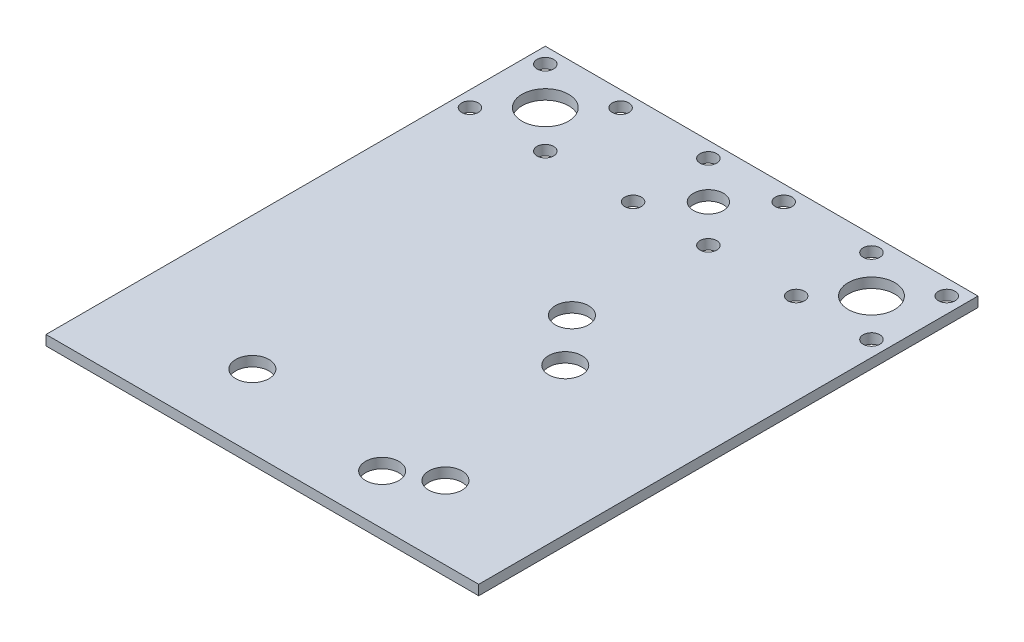
ISO-10303-21;
HEADER;
FILE_DESCRIPTION(('STEP AP214'),'2;1');
FILE_NAME('part.step','',(''),(''),'','','');
FILE_SCHEMA(('AUTOMOTIVE_DESIGN { 1 0 10303 214 1 1 1 1 }'));
ENDSEC;
DATA;
#1=APPLICATION_CONTEXT('core data for automotive mechanical design processes');
#2=APPLICATION_PROTOCOL_DEFINITION('international standard','automotive_design',2000,#1);
#3=PRODUCT_CONTEXT('',#1,'mechanical');
#4=PRODUCT('Part','Part','',(#3));
#5=PRODUCT_RELATED_PRODUCT_CATEGORY('part','',(#4));
#6=PRODUCT_DEFINITION_FORMATION('','',#4);
#7=PRODUCT_DEFINITION_CONTEXT('part definition',#1,'design');
#8=PRODUCT_DEFINITION('design','',#6,#7);
#9=PRODUCT_DEFINITION_SHAPE('','',#8);
#10=(LENGTH_UNIT() NAMED_UNIT(*) SI_UNIT(.MILLI.,.METRE.));
#11=(NAMED_UNIT(*) PLANE_ANGLE_UNIT() SI_UNIT($,.RADIAN.));
#12=(NAMED_UNIT(*) SI_UNIT($,.STERADIAN.) SOLID_ANGLE_UNIT());
#13=UNCERTAINTY_MEASURE_WITH_UNIT(LENGTH_MEASURE(1.E-05),#10,'distance_accuracy_value','');
#14=(GEOMETRIC_REPRESENTATION_CONTEXT(3) GLOBAL_UNCERTAINTY_ASSIGNED_CONTEXT((#13)) GLOBAL_UNIT_ASSIGNED_CONTEXT((#10,
#11,#12)) REPRESENTATION_CONTEXT('',''));
#15=CARTESIAN_POINT('',(0.,0.,0.));
#16=DIRECTION('',(0.,0.,1.));
#17=DIRECTION('',(1.,0.,0.));
#18=AXIS2_PLACEMENT_3D('',#15,#16,#17);
#19=CARTESIAN_POINT('',(0.,3.,0.));
#20=DIRECTION('',(1.,0.,0.));
#21=DIRECTION('',(0.,0.,-1.));
#22=AXIS2_PLACEMENT_3D('',#19,#20,#21);
#23=PLANE('',#22);
#24=DIRECTION('',(0.,0.,1.));
#25=VECTOR('',#24,1.);
#26=CARTESIAN_POINT('',(0.,0.,0.));
#27=LINE('',#26,#25);
#28=CARTESIAN_POINT('',(0.,0.,0.));
#29=VERTEX_POINT('',#28);
#30=CARTESIAN_POINT('',(0.,0.,150.));
#31=VERTEX_POINT('',#30);
#32=EDGE_CURVE('E96',#29,#31,#27,.T.);
#33=ORIENTED_EDGE('',*,*,#32,.T.);
#34=DIRECTION('',(0.,-1.,0.));
#35=VECTOR('',#34,1.);
#36=CARTESIAN_POINT('',(0.,3.,150.));
#37=LINE('',#36,#35);
#38=CARTESIAN_POINT('',(0.,3.,150.));
#39=VERTEX_POINT('',#38);
#40=EDGE_CURVE('E11',#39,#31,#37,.T.);
#41=ORIENTED_EDGE('',*,*,#40,.F.);
#42=DIRECTION('',(0.,0.,1.));
#43=VECTOR('',#42,1.);
#44=CARTESIAN_POINT('',(0.,3.,0.));
#45=LINE('',#44,#43);
#46=CARTESIAN_POINT('',(0.,3.,0.));
#47=VERTEX_POINT('',#46);
#48=EDGE_CURVE('E84',#47,#39,#45,.T.);
#49=ORIENTED_EDGE('',*,*,#48,.F.);
#50=DIRECTION('',(0.,-1.,0.));
#51=VECTOR('',#50,1.);
#52=CARTESIAN_POINT('',(0.,3.,0.));
#53=LINE('',#52,#51);
#54=EDGE_CURVE('E92',#47,#29,#53,.T.);
#55=ORIENTED_EDGE('',*,*,#54,.T.);
#56=EDGE_LOOP('',(#33,#41,#49,#55));
#57=FACE_BOUND('',#56,.T.);
#58=ADVANCED_FACE('F33',(#57),#23,.F.);
#59=CARTESIAN_POINT('',(0.,3.,150.));
#60=DIRECTION('',(0.,0.,-1.));
#61=DIRECTION('',(-1.,0.,0.));
#62=AXIS2_PLACEMENT_3D('',#59,#60,#61);
#63=PLANE('',#62);
#64=DIRECTION('',(1.,0.,0.));
#65=VECTOR('',#64,1.);
#66=CARTESIAN_POINT('',(0.,0.,150.));
#67=LINE('',#66,#65);
#68=CARTESIAN_POINT('',(130.,0.,150.));
#69=VERTEX_POINT('',#68);
#70=EDGE_CURVE('E88',#31,#69,#67,.T.);
#71=ORIENTED_EDGE('',*,*,#70,.T.);
#72=DIRECTION('',(0.,-1.,0.));
#73=VECTOR('',#72,1.);
#74=CARTESIAN_POINT('',(130.,3.,150.));
#75=LINE('',#74,#73);
#76=CARTESIAN_POINT('',(130.,3.,150.));
#77=VERTEX_POINT('',#76);
#78=EDGE_CURVE('E41',#77,#69,#75,.T.);
#79=ORIENTED_EDGE('',*,*,#78,.F.);
#80=DIRECTION('',(1.,0.,0.));
#81=VECTOR('',#80,1.);
#82=CARTESIAN_POINT('',(0.,3.,150.));
#83=LINE('',#82,#81);
#84=EDGE_CURVE('E79',#39,#77,#83,.T.);
#85=ORIENTED_EDGE('',*,*,#84,.F.);
#86=ORIENTED_EDGE('',*,*,#40,.T.);
#87=EDGE_LOOP('',(#71,#79,#85,#86));
#88=FACE_BOUND('',#87,.T.);
#89=ADVANCED_FACE('F87',(#88),#63,.F.);
#90=CARTESIAN_POINT('',(130.,3.,0.));
#91=DIRECTION('',(-1.,0.,0.));
#92=DIRECTION('',(0.,0.,1.));
#93=AXIS2_PLACEMENT_3D('',#90,#91,#92);
#94=PLANE('',#93);
#95=DIRECTION('',(0.,0.,-1.));
#96=VECTOR('',#95,1.);
#97=CARTESIAN_POINT('',(130.,0.,0.));
#98=LINE('',#97,#96);
#99=CARTESIAN_POINT('',(130.,0.,0.));
#100=VERTEX_POINT('',#99);
#101=EDGE_CURVE('E66',#69,#100,#98,.T.);
#102=ORIENTED_EDGE('',*,*,#101,.T.);
#103=DIRECTION('',(0.,-1.,0.));
#104=VECTOR('',#103,1.);
#105=CARTESIAN_POINT('',(130.,3.,0.));
#106=LINE('',#105,#104);
#107=CARTESIAN_POINT('',(130.,3.,0.));
#108=VERTEX_POINT('',#107);
#109=EDGE_CURVE('E89',#108,#100,#106,.T.);
#110=ORIENTED_EDGE('',*,*,#109,.F.);
#111=DIRECTION('',(0.,0.,-1.));
#112=VECTOR('',#111,1.);
#113=CARTESIAN_POINT('',(130.,3.,0.));
#114=LINE('',#113,#112);
#115=EDGE_CURVE('E82',#77,#108,#114,.T.);
#116=ORIENTED_EDGE('',*,*,#115,.F.);
#117=ORIENTED_EDGE('',*,*,#78,.T.);
#118=EDGE_LOOP('',(#102,#110,#116,#117));
#119=FACE_BOUND('',#118,.T.);
#120=ADVANCED_FACE('F90',(#119),#94,.F.);
#121=CARTESIAN_POINT('',(0.,3.,0.));
#122=DIRECTION('',(0.,0.,1.));
#123=DIRECTION('',(1.,0.,0.));
#124=AXIS2_PLACEMENT_3D('',#121,#122,#123);
#125=PLANE('',#124);
#126=DIRECTION('',(-1.,0.,0.));
#127=VECTOR('',#126,1.);
#128=CARTESIAN_POINT('',(0.,0.,0.));
#129=LINE('',#128,#127);
#130=EDGE_CURVE('E72',#100,#29,#129,.T.);
#131=ORIENTED_EDGE('',*,*,#130,.T.);
#132=ORIENTED_EDGE('',*,*,#54,.F.);
#133=DIRECTION('',(-1.,0.,0.));
#134=VECTOR('',#133,1.);
#135=CARTESIAN_POINT('',(0.,3.,0.));
#136=LINE('',#135,#134);
#137=EDGE_CURVE('E49',#108,#47,#136,.T.);
#138=ORIENTED_EDGE('',*,*,#137,.F.);
#139=ORIENTED_EDGE('',*,*,#109,.T.);
#140=EDGE_LOOP('',(#131,#132,#138,#139));
#141=FACE_BOUND('',#140,.T.);
#142=ADVANCED_FACE('F104',(#141),#125,.F.);
#143=CARTESIAN_POINT('',(0.,3.,0.));
#144=DIRECTION('',(0.,1.,0.));
#145=DIRECTION('',(0.,0.,1.));
#146=AXIS2_PLACEMENT_3D('',#143,#144,#145);
#147=PLANE('',#146);
#148=CARTESIAN_POINT('',(53.6862915010153,3.,27.3137084989848));
#149=DIRECTION('',(0.,1.,0.));
#150=DIRECTION('',(0.,0.,1.));
#151=AXIS2_PLACEMENT_3D('',#148,#149,#150);
#152=CIRCLE('',#151,2.5);
#153=CARTESIAN_POINT('',(53.6862915010153,3.,29.8137084989848));
#154=VERTEX_POINT('',#153);
#155=EDGE_CURVE('E226',#154,#154,#152,.T.);
#156=ORIENTED_EDGE('',*,*,#155,.F.);
#157=EDGE_LOOP('',(#156));
#158=FACE_BOUND('',#157,.T.);
#159=CARTESIAN_POINT('',(76.3137084989847,3.,27.3137084989848));
#160=DIRECTION('',(0.,1.,0.));
#161=DIRECTION('',(0.,0.,1.));
#162=AXIS2_PLACEMENT_3D('',#159,#160,#161);
#163=CIRCLE('',#162,2.5);
#164=CARTESIAN_POINT('',(76.3137084989847,3.,29.8137084989848));
#165=VERTEX_POINT('',#164);
#166=EDGE_CURVE('E220',#165,#165,#163,.T.);
#167=ORIENTED_EDGE('',*,*,#166,.F.);
#168=EDGE_LOOP('',(#167));
#169=FACE_BOUND('',#168,.T.);
#170=CARTESIAN_POINT('',(76.3137084989847,3.,4.6862915010152));
#171=DIRECTION('',(0.,1.,0.));
#172=DIRECTION('',(0.,0.,1.));
#173=AXIS2_PLACEMENT_3D('',#170,#171,#172);
#174=CIRCLE('',#173,2.5);
#175=CARTESIAN_POINT('',(76.3137084989847,3.,7.18629150101521));
#176=VERTEX_POINT('',#175);
#177=EDGE_CURVE('E214',#176,#176,#174,.T.);
#178=ORIENTED_EDGE('',*,*,#177,.F.);
#179=EDGE_LOOP('',(#178));
#180=FACE_BOUND('',#179,.T.);
#181=CARTESIAN_POINT('',(53.6862915010153,3.,4.6862915010152));
#182=DIRECTION('',(0.,1.,0.));
#183=DIRECTION('',(0.,0.,1.));
#184=AXIS2_PLACEMENT_3D('',#181,#182,#183);
#185=CIRCLE('',#184,2.5);
#186=CARTESIAN_POINT('',(53.6862915010153,3.,7.18629150101521));
#187=VERTEX_POINT('',#186);
#188=EDGE_CURVE('E208',#187,#187,#185,.T.);
#189=ORIENTED_EDGE('',*,*,#188,.F.);
#190=EDGE_LOOP('',(#189));
#191=FACE_BOUND('',#190,.T.);
#192=CARTESIAN_POINT('',(65.,3.,16.));
#193=DIRECTION('',(0.,1.,0.));
#194=DIRECTION('',(0.,0.,1.));
#195=AXIS2_PLACEMENT_3D('',#192,#193,#194);
#196=CIRCLE('',#195,4.5);
#197=CARTESIAN_POINT('',(65.,3.,20.5));
#198=VERTEX_POINT('',#197);
#199=EDGE_CURVE('E202',#198,#198,#196,.T.);
#200=ORIENTED_EDGE('',*,*,#199,.F.);
#201=EDGE_LOOP('',(#200));
#202=FACE_BOUND('',#201,.T.);
#203=CARTESIAN_POINT('',(86.0000000000001,3.,80.));
#204=DIRECTION('',(0.,1.,0.));
#205=DIRECTION('',(0.,0.,1.));
#206=AXIS2_PLACEMENT_3D('',#203,#204,#205);
#207=CIRCLE('',#206,5.);
#208=CARTESIAN_POINT('',(86.0000000000001,3.,85.));
#209=VERTEX_POINT('',#208);
#210=EDGE_CURVE('E196',#209,#209,#207,.T.);
#211=ORIENTED_EDGE('',*,*,#210,.F.);
#212=EDGE_LOOP('',(#211));
#213=FACE_BOUND('',#212,.T.);
#214=CARTESIAN_POINT('',(86.0000000000001,3.,135.));
#215=DIRECTION('',(0.,1.,0.));
#216=DIRECTION('',(0.,0.,1.));
#217=AXIS2_PLACEMENT_3D('',#214,#215,#216);
#218=CIRCLE('',#217,5.);
#219=CARTESIAN_POINT('',(86.0000000000001,3.,140.));
#220=VERTEX_POINT('',#219);
#221=EDGE_CURVE('E190',#220,#220,#218,.T.);
#222=ORIENTED_EDGE('',*,*,#221,.F.);
#223=EDGE_LOOP('',(#222));
#224=FACE_BOUND('',#223,.T.);
#225=CARTESIAN_POINT('',(4.68629150101523,3.,27.3137084989848));
#226=DIRECTION('',(0.,1.,0.));
#227=DIRECTION('',(0.,0.,1.));
#228=AXIS2_PLACEMENT_3D('',#225,#226,#227);
#229=CIRCLE('',#228,2.5);
#230=CARTESIAN_POINT('',(4.68629150101523,3.,29.8137084989848));
#231=VERTEX_POINT('',#230);
#232=EDGE_CURVE('E184',#231,#231,#229,.T.);
#233=ORIENTED_EDGE('',*,*,#232,.F.);
#234=EDGE_LOOP('',(#233));
#235=FACE_BOUND('',#234,.T.);
#236=CARTESIAN_POINT('',(4.68629150101522,3.,4.68629150101524));
#237=DIRECTION('',(0.,1.,0.));
#238=DIRECTION('',(0.,0.,1.));
#239=AXIS2_PLACEMENT_3D('',#236,#237,#238);
#240=CIRCLE('',#239,2.5);
#241=CARTESIAN_POINT('',(4.68629150101522,3.,7.18629150101524));
#242=VERTEX_POINT('',#241);
#243=EDGE_CURVE('E178',#242,#242,#240,.T.);
#244=ORIENTED_EDGE('',*,*,#243,.F.);
#245=EDGE_LOOP('',(#244));
#246=FACE_BOUND('',#245,.T.);
#247=CARTESIAN_POINT('',(27.3137084989847,3.,4.68629150101524));
#248=DIRECTION('',(0.,1.,0.));
#249=DIRECTION('',(0.,0.,1.));
#250=AXIS2_PLACEMENT_3D('',#247,#248,#249);
#251=CIRCLE('',#250,2.5);
#252=CARTESIAN_POINT('',(27.3137084989847,3.,7.18629150101524));
#253=VERTEX_POINT('',#252);
#254=EDGE_CURVE('E172',#253,#253,#251,.T.);
#255=ORIENTED_EDGE('',*,*,#254,.F.);
#256=EDGE_LOOP('',(#255));
#257=FACE_BOUND('',#256,.T.);
#258=CARTESIAN_POINT('',(27.3137084989847,3.,27.3137084989848));
#259=DIRECTION('',(0.,1.,0.));
#260=DIRECTION('',(0.,0.,1.));
#261=AXIS2_PLACEMENT_3D('',#258,#259,#260);
#262=CIRCLE('',#261,2.5);
#263=CARTESIAN_POINT('',(27.3137084989847,3.,29.8137084989848));
#264=VERTEX_POINT('',#263);
#265=EDGE_CURVE('E166',#264,#264,#262,.T.);
#266=ORIENTED_EDGE('',*,*,#265,.F.);
#267=EDGE_LOOP('',(#266));
#268=FACE_BOUND('',#267,.T.);
#269=CARTESIAN_POINT('',(102.686291501015,3.,27.3137084989848));
#270=DIRECTION('',(0.,1.,0.));
#271=DIRECTION('',(0.,0.,1.));
#272=AXIS2_PLACEMENT_3D('',#269,#270,#271);
#273=CIRCLE('',#272,2.5);
#274=CARTESIAN_POINT('',(102.686291501015,3.,29.8137084989848));
#275=VERTEX_POINT('',#274);
#276=EDGE_CURVE('E160',#275,#275,#273,.T.);
#277=ORIENTED_EDGE('',*,*,#276,.F.);
#278=EDGE_LOOP('',(#277));
#279=FACE_BOUND('',#278,.T.);
#280=CARTESIAN_POINT('',(125.313708498985,3.,27.3137084989848));
#281=DIRECTION('',(0.,1.,0.));
#282=DIRECTION('',(0.,0.,1.));
#283=AXIS2_PLACEMENT_3D('',#280,#281,#282);
#284=CIRCLE('',#283,2.5);
#285=CARTESIAN_POINT('',(125.313708498985,3.,29.8137084989848));
#286=VERTEX_POINT('',#285);
#287=EDGE_CURVE('E154',#286,#286,#284,.T.);
#288=ORIENTED_EDGE('',*,*,#287,.F.);
#289=EDGE_LOOP('',(#288));
#290=FACE_BOUND('',#289,.T.);
#291=CARTESIAN_POINT('',(125.313708498985,3.,4.68629150101525));
#292=DIRECTION('',(0.,1.,0.));
#293=DIRECTION('',(0.,0.,1.));
#294=AXIS2_PLACEMENT_3D('',#291,#292,#293);
#295=CIRCLE('',#294,2.5);
#296=CARTESIAN_POINT('',(125.313708498985,3.,7.18629150101525));
#297=VERTEX_POINT('',#296);
#298=EDGE_CURVE('E148',#297,#297,#295,.T.);
#299=ORIENTED_EDGE('',*,*,#298,.F.);
#300=EDGE_LOOP('',(#299));
#301=FACE_BOUND('',#300,.T.);
#302=CARTESIAN_POINT('',(102.686291501015,3.,4.68629150101525));
#303=DIRECTION('',(0.,1.,0.));
#304=DIRECTION('',(0.,0.,1.));
#305=AXIS2_PLACEMENT_3D('',#302,#303,#304);
#306=CIRCLE('',#305,2.5);
#307=CARTESIAN_POINT('',(102.686291501015,3.,7.18629150101525));
#308=VERTEX_POINT('',#307);
#309=EDGE_CURVE('E142',#308,#308,#306,.T.);
#310=ORIENTED_EDGE('',*,*,#309,.F.);
#311=EDGE_LOOP('',(#310));
#312=FACE_BOUND('',#311,.T.);
#313=CARTESIAN_POINT('',(16.,3.,16.));
#314=DIRECTION('',(0.,1.,0.));
#315=DIRECTION('',(0.,0.,1.));
#316=AXIS2_PLACEMENT_3D('',#313,#314,#315);
#317=CIRCLE('',#316,7.);
#318=CARTESIAN_POINT('',(16.,3.,23.));
#319=VERTEX_POINT('',#318);
#320=EDGE_CURVE('E136',#319,#319,#317,.T.);
#321=ORIENTED_EDGE('',*,*,#320,.F.);
#322=EDGE_LOOP('',(#321));
#323=FACE_BOUND('',#322,.T.);
#324=CARTESIAN_POINT('',(114.,3.,16.));
#325=DIRECTION('',(0.,1.,0.));
#326=DIRECTION('',(0.,0.,1.));
#327=AXIS2_PLACEMENT_3D('',#324,#325,#326);
#328=CIRCLE('',#327,7.00000000000001);
#329=CARTESIAN_POINT('',(114.,3.,23.));
#330=VERTEX_POINT('',#329);
#331=EDGE_CURVE('E130',#330,#330,#328,.T.);
#332=ORIENTED_EDGE('',*,*,#331,.F.);
#333=EDGE_LOOP('',(#332));
#334=FACE_BOUND('',#333,.T.);
#335=CARTESIAN_POINT('',(98.0000000000001,3.,128.));
#336=DIRECTION('',(0.,1.,0.));
#337=DIRECTION('',(0.,0.,1.));
#338=AXIS2_PLACEMENT_3D('',#335,#336,#337);
#339=CIRCLE('',#338,5.);
#340=CARTESIAN_POINT('',(98.0000000000001,3.,133.));
#341=VERTEX_POINT('',#340);
#342=EDGE_CURVE('E124',#341,#341,#339,.T.);
#343=ORIENTED_EDGE('',*,*,#342,.F.);
#344=EDGE_LOOP('',(#343));
#345=FACE_BOUND('',#344,.T.);
#346=CARTESIAN_POINT('',(40.0000000000001,3.,128.));
#347=DIRECTION('',(0.,1.,0.));
#348=DIRECTION('',(0.,0.,1.));
#349=AXIS2_PLACEMENT_3D('',#346,#347,#348);
#350=CIRCLE('',#349,5.);
#351=CARTESIAN_POINT('',(40.0000000000001,3.,133.));
#352=VERTEX_POINT('',#351);
#353=EDGE_CURVE('E118',#352,#352,#350,.T.);
#354=ORIENTED_EDGE('',*,*,#353,.F.);
#355=EDGE_LOOP('',(#354));
#356=FACE_BOUND('',#355,.T.);
#357=CARTESIAN_POINT('',(74.0000000000001,3.,66.));
#358=DIRECTION('',(0.,1.,0.));
#359=DIRECTION('',(0.,0.,1.));
#360=AXIS2_PLACEMENT_3D('',#357,#358,#359);
#361=CIRCLE('',#360,5.);
#362=CARTESIAN_POINT('',(74.0000000000001,3.,71.));
#363=VERTEX_POINT('',#362);
#364=EDGE_CURVE('E112',#363,#363,#361,.T.);
#365=ORIENTED_EDGE('',*,*,#364,.F.);
#366=EDGE_LOOP('',(#365));
#367=FACE_BOUND('',#366,.T.);
#368=ORIENTED_EDGE('',*,*,#48,.T.);
#369=ORIENTED_EDGE('',*,*,#84,.T.);
#370=ORIENTED_EDGE('',*,*,#115,.T.);
#371=ORIENTED_EDGE('',*,*,#137,.T.);
#372=EDGE_LOOP('',(#368,#369,#370,#371));
#373=FACE_BOUND('',#372,.T.);
#374=ADVANCED_FACE('F80',(#158,#169,#180,#191,#202,#213,#224,#235,#246,#257,#268,#279,#290,#301,
#312,#323,#334,#345,#356,#367,#373),#147,.T.);
#375=CARTESIAN_POINT('',(0.,0.,0.));
#376=DIRECTION('',(0.,1.,0.));
#377=DIRECTION('',(0.,0.,1.));
#378=AXIS2_PLACEMENT_3D('',#375,#376,#377);
#379=PLANE('',#378);
#380=CARTESIAN_POINT('',(53.6862915010153,0.,27.3137084989848));
#381=DIRECTION('',(0.,1.,0.));
#382=DIRECTION('',(0.,0.,1.));
#383=AXIS2_PLACEMENT_3D('',#380,#381,#382);
#384=CIRCLE('',#383,2.5);
#385=CARTESIAN_POINT('',(53.6862915010153,0.,29.8137084989848));
#386=VERTEX_POINT('',#385);
#387=EDGE_CURVE('E223',#386,#386,#384,.T.);
#388=ORIENTED_EDGE('',*,*,#387,.T.);
#389=EDGE_LOOP('',(#388));
#390=FACE_BOUND('',#389,.T.);
#391=CARTESIAN_POINT('',(76.3137084989847,0.,27.3137084989848));
#392=DIRECTION('',(0.,1.,0.));
#393=DIRECTION('',(0.,0.,1.));
#394=AXIS2_PLACEMENT_3D('',#391,#392,#393);
#395=CIRCLE('',#394,2.5);
#396=CARTESIAN_POINT('',(76.3137084989847,0.,29.8137084989848));
#397=VERTEX_POINT('',#396);
#398=EDGE_CURVE('E217',#397,#397,#395,.T.);
#399=ORIENTED_EDGE('',*,*,#398,.T.);
#400=EDGE_LOOP('',(#399));
#401=FACE_BOUND('',#400,.T.);
#402=CARTESIAN_POINT('',(76.3137084989847,0.,4.6862915010152));
#403=DIRECTION('',(0.,1.,0.));
#404=DIRECTION('',(0.,0.,1.));
#405=AXIS2_PLACEMENT_3D('',#402,#403,#404);
#406=CIRCLE('',#405,2.5);
#407=CARTESIAN_POINT('',(76.3137084989847,0.,7.18629150101521));
#408=VERTEX_POINT('',#407);
#409=EDGE_CURVE('E211',#408,#408,#406,.T.);
#410=ORIENTED_EDGE('',*,*,#409,.T.);
#411=EDGE_LOOP('',(#410));
#412=FACE_BOUND('',#411,.T.);
#413=CARTESIAN_POINT('',(53.6862915010153,0.,4.6862915010152));
#414=DIRECTION('',(0.,1.,0.));
#415=DIRECTION('',(0.,0.,1.));
#416=AXIS2_PLACEMENT_3D('',#413,#414,#415);
#417=CIRCLE('',#416,2.5);
#418=CARTESIAN_POINT('',(53.6862915010153,0.,7.18629150101521));
#419=VERTEX_POINT('',#418);
#420=EDGE_CURVE('E205',#419,#419,#417,.T.);
#421=ORIENTED_EDGE('',*,*,#420,.T.);
#422=EDGE_LOOP('',(#421));
#423=FACE_BOUND('',#422,.T.);
#424=CARTESIAN_POINT('',(65.,0.,16.));
#425=DIRECTION('',(0.,1.,0.));
#426=DIRECTION('',(0.,0.,1.));
#427=AXIS2_PLACEMENT_3D('',#424,#425,#426);
#428=CIRCLE('',#427,4.5);
#429=CARTESIAN_POINT('',(65.,0.,20.5));
#430=VERTEX_POINT('',#429);
#431=EDGE_CURVE('E199',#430,#430,#428,.T.);
#432=ORIENTED_EDGE('',*,*,#431,.T.);
#433=EDGE_LOOP('',(#432));
#434=FACE_BOUND('',#433,.T.);
#435=CARTESIAN_POINT('',(86.0000000000001,0.,80.));
#436=DIRECTION('',(0.,1.,0.));
#437=DIRECTION('',(0.,0.,1.));
#438=AXIS2_PLACEMENT_3D('',#435,#436,#437);
#439=CIRCLE('',#438,5.);
#440=CARTESIAN_POINT('',(86.0000000000001,0.,85.));
#441=VERTEX_POINT('',#440);
#442=EDGE_CURVE('E193',#441,#441,#439,.T.);
#443=ORIENTED_EDGE('',*,*,#442,.T.);
#444=EDGE_LOOP('',(#443));
#445=FACE_BOUND('',#444,.T.);
#446=CARTESIAN_POINT('',(86.0000000000001,0.,135.));
#447=DIRECTION('',(0.,1.,0.));
#448=DIRECTION('',(0.,0.,1.));
#449=AXIS2_PLACEMENT_3D('',#446,#447,#448);
#450=CIRCLE('',#449,5.);
#451=CARTESIAN_POINT('',(86.0000000000001,0.,140.));
#452=VERTEX_POINT('',#451);
#453=EDGE_CURVE('E187',#452,#452,#450,.T.);
#454=ORIENTED_EDGE('',*,*,#453,.T.);
#455=EDGE_LOOP('',(#454));
#456=FACE_BOUND('',#455,.T.);
#457=CARTESIAN_POINT('',(4.68629150101523,0.,27.3137084989848));
#458=DIRECTION('',(0.,1.,0.));
#459=DIRECTION('',(0.,0.,1.));
#460=AXIS2_PLACEMENT_3D('',#457,#458,#459);
#461=CIRCLE('',#460,2.5);
#462=CARTESIAN_POINT('',(4.68629150101523,0.,29.8137084989848));
#463=VERTEX_POINT('',#462);
#464=EDGE_CURVE('E181',#463,#463,#461,.T.);
#465=ORIENTED_EDGE('',*,*,#464,.T.);
#466=EDGE_LOOP('',(#465));
#467=FACE_BOUND('',#466,.T.);
#468=CARTESIAN_POINT('',(4.68629150101522,0.,4.68629150101524));
#469=DIRECTION('',(0.,1.,0.));
#470=DIRECTION('',(0.,0.,1.));
#471=AXIS2_PLACEMENT_3D('',#468,#469,#470);
#472=CIRCLE('',#471,2.5);
#473=CARTESIAN_POINT('',(4.68629150101522,0.,7.18629150101524));
#474=VERTEX_POINT('',#473);
#475=EDGE_CURVE('E175',#474,#474,#472,.T.);
#476=ORIENTED_EDGE('',*,*,#475,.T.);
#477=EDGE_LOOP('',(#476));
#478=FACE_BOUND('',#477,.T.);
#479=CARTESIAN_POINT('',(27.3137084989847,0.,4.68629150101524));
#480=DIRECTION('',(0.,1.,0.));
#481=DIRECTION('',(0.,0.,1.));
#482=AXIS2_PLACEMENT_3D('',#479,#480,#481);
#483=CIRCLE('',#482,2.5);
#484=CARTESIAN_POINT('',(27.3137084989847,0.,7.18629150101524));
#485=VERTEX_POINT('',#484);
#486=EDGE_CURVE('E169',#485,#485,#483,.T.);
#487=ORIENTED_EDGE('',*,*,#486,.T.);
#488=EDGE_LOOP('',(#487));
#489=FACE_BOUND('',#488,.T.);
#490=CARTESIAN_POINT('',(27.3137084989847,0.,27.3137084989848));
#491=DIRECTION('',(0.,1.,0.));
#492=DIRECTION('',(0.,0.,1.));
#493=AXIS2_PLACEMENT_3D('',#490,#491,#492);
#494=CIRCLE('',#493,2.5);
#495=CARTESIAN_POINT('',(27.3137084989847,0.,29.8137084989848));
#496=VERTEX_POINT('',#495);
#497=EDGE_CURVE('E163',#496,#496,#494,.T.);
#498=ORIENTED_EDGE('',*,*,#497,.T.);
#499=EDGE_LOOP('',(#498));
#500=FACE_BOUND('',#499,.T.);
#501=CARTESIAN_POINT('',(102.686291501015,0.,27.3137084989848));
#502=DIRECTION('',(0.,1.,0.));
#503=DIRECTION('',(0.,0.,1.));
#504=AXIS2_PLACEMENT_3D('',#501,#502,#503);
#505=CIRCLE('',#504,2.5);
#506=CARTESIAN_POINT('',(102.686291501015,0.,29.8137084989848));
#507=VERTEX_POINT('',#506);
#508=EDGE_CURVE('E157',#507,#507,#505,.T.);
#509=ORIENTED_EDGE('',*,*,#508,.T.);
#510=EDGE_LOOP('',(#509));
#511=FACE_BOUND('',#510,.T.);
#512=CARTESIAN_POINT('',(125.313708498985,0.,27.3137084989848));
#513=DIRECTION('',(0.,1.,0.));
#514=DIRECTION('',(0.,0.,1.));
#515=AXIS2_PLACEMENT_3D('',#512,#513,#514);
#516=CIRCLE('',#515,2.5);
#517=CARTESIAN_POINT('',(125.313708498985,0.,29.8137084989848));
#518=VERTEX_POINT('',#517);
#519=EDGE_CURVE('E151',#518,#518,#516,.T.);
#520=ORIENTED_EDGE('',*,*,#519,.T.);
#521=EDGE_LOOP('',(#520));
#522=FACE_BOUND('',#521,.T.);
#523=CARTESIAN_POINT('',(125.313708498985,0.,4.68629150101525));
#524=DIRECTION('',(0.,1.,0.));
#525=DIRECTION('',(0.,0.,1.));
#526=AXIS2_PLACEMENT_3D('',#523,#524,#525);
#527=CIRCLE('',#526,2.5);
#528=CARTESIAN_POINT('',(125.313708498985,0.,7.18629150101525));
#529=VERTEX_POINT('',#528);
#530=EDGE_CURVE('E145',#529,#529,#527,.T.);
#531=ORIENTED_EDGE('',*,*,#530,.T.);
#532=EDGE_LOOP('',(#531));
#533=FACE_BOUND('',#532,.T.);
#534=CARTESIAN_POINT('',(102.686291501015,0.,4.68629150101525));
#535=DIRECTION('',(0.,1.,0.));
#536=DIRECTION('',(0.,0.,1.));
#537=AXIS2_PLACEMENT_3D('',#534,#535,#536);
#538=CIRCLE('',#537,2.5);
#539=CARTESIAN_POINT('',(102.686291501015,0.,7.18629150101525));
#540=VERTEX_POINT('',#539);
#541=EDGE_CURVE('E139',#540,#540,#538,.T.);
#542=ORIENTED_EDGE('',*,*,#541,.T.);
#543=EDGE_LOOP('',(#542));
#544=FACE_BOUND('',#543,.T.);
#545=CARTESIAN_POINT('',(16.,0.,16.));
#546=DIRECTION('',(0.,1.,0.));
#547=DIRECTION('',(0.,0.,1.));
#548=AXIS2_PLACEMENT_3D('',#545,#546,#547);
#549=CIRCLE('',#548,7.);
#550=CARTESIAN_POINT('',(16.,0.,23.));
#551=VERTEX_POINT('',#550);
#552=EDGE_CURVE('E133',#551,#551,#549,.T.);
#553=ORIENTED_EDGE('',*,*,#552,.T.);
#554=EDGE_LOOP('',(#553));
#555=FACE_BOUND('',#554,.T.);
#556=CARTESIAN_POINT('',(114.,0.,16.));
#557=DIRECTION('',(0.,1.,0.));
#558=DIRECTION('',(0.,0.,1.));
#559=AXIS2_PLACEMENT_3D('',#556,#557,#558);
#560=CIRCLE('',#559,7.00000000000001);
#561=CARTESIAN_POINT('',(114.,0.,23.));
#562=VERTEX_POINT('',#561);
#563=EDGE_CURVE('E127',#562,#562,#560,.T.);
#564=ORIENTED_EDGE('',*,*,#563,.T.);
#565=EDGE_LOOP('',(#564));
#566=FACE_BOUND('',#565,.T.);
#567=CARTESIAN_POINT('',(98.0000000000001,0.,128.));
#568=DIRECTION('',(0.,1.,0.));
#569=DIRECTION('',(0.,0.,1.));
#570=AXIS2_PLACEMENT_3D('',#567,#568,#569);
#571=CIRCLE('',#570,5.);
#572=CARTESIAN_POINT('',(98.0000000000001,0.,133.));
#573=VERTEX_POINT('',#572);
#574=EDGE_CURVE('E121',#573,#573,#571,.T.);
#575=ORIENTED_EDGE('',*,*,#574,.T.);
#576=EDGE_LOOP('',(#575));
#577=FACE_BOUND('',#576,.T.);
#578=CARTESIAN_POINT('',(40.0000000000001,0.,128.));
#579=DIRECTION('',(0.,1.,0.));
#580=DIRECTION('',(0.,0.,1.));
#581=AXIS2_PLACEMENT_3D('',#578,#579,#580);
#582=CIRCLE('',#581,5.);
#583=CARTESIAN_POINT('',(40.0000000000001,0.,133.));
#584=VERTEX_POINT('',#583);
#585=EDGE_CURVE('E115',#584,#584,#582,.T.);
#586=ORIENTED_EDGE('',*,*,#585,.T.);
#587=EDGE_LOOP('',(#586));
#588=FACE_BOUND('',#587,.T.);
#589=CARTESIAN_POINT('',(74.0000000000001,0.,66.));
#590=DIRECTION('',(0.,1.,0.));
#591=DIRECTION('',(0.,0.,1.));
#592=AXIS2_PLACEMENT_3D('',#589,#590,#591);
#593=CIRCLE('',#592,5.);
#594=CARTESIAN_POINT('',(74.0000000000001,0.,71.));
#595=VERTEX_POINT('',#594);
#596=EDGE_CURVE('E99',#595,#595,#593,.T.);
#597=ORIENTED_EDGE('',*,*,#596,.T.);
#598=EDGE_LOOP('',(#597));
#599=FACE_BOUND('',#598,.T.);
#600=ORIENTED_EDGE('',*,*,#32,.F.);
#601=ORIENTED_EDGE('',*,*,#130,.F.);
#602=ORIENTED_EDGE('',*,*,#101,.F.);
#603=ORIENTED_EDGE('',*,*,#70,.F.);
#604=EDGE_LOOP('',(#600,#601,#602,#603));
#605=FACE_BOUND('',#604,.T.);
#606=ADVANCED_FACE('F107',(#390,#401,#412,#423,#434,#445,#456,#467,#478,#489,#500,#511,#522,
#533,#544,#555,#566,#577,#588,#599,#605),#379,.F.);
#607=CARTESIAN_POINT('',(74.0000000000001,3.,66.));
#608=DIRECTION('',(0.,1.,0.));
#609=DIRECTION('',(0.,0.,1.));
#610=AXIS2_PLACEMENT_3D('',#607,#608,#609);
#611=CYLINDRICAL_SURFACE('',#610,5.);
#612=ORIENTED_EDGE('',*,*,#596,.F.);
#613=EDGE_LOOP('',(#612));
#614=FACE_BOUND('',#613,.T.);
#615=ORIENTED_EDGE('',*,*,#364,.T.);
#616=EDGE_LOOP('',(#615));
#617=FACE_BOUND('',#616,.T.);
#618=ADVANCED_FACE('F273',(#614,#617),#611,.F.);
#619=CARTESIAN_POINT('',(40.0000000000001,3.,128.));
#620=DIRECTION('',(0.,1.,0.));
#621=DIRECTION('',(0.,0.,1.));
#622=AXIS2_PLACEMENT_3D('',#619,#620,#621);
#623=CYLINDRICAL_SURFACE('',#622,5.);
#624=ORIENTED_EDGE('',*,*,#585,.F.);
#625=EDGE_LOOP('',(#624));
#626=FACE_BOUND('',#625,.T.);
#627=ORIENTED_EDGE('',*,*,#353,.T.);
#628=EDGE_LOOP('',(#627));
#629=FACE_BOUND('',#628,.T.);
#630=ADVANCED_FACE('F275',(#626,#629),#623,.F.);
#631=CARTESIAN_POINT('',(98.0000000000001,3.,128.));
#632=DIRECTION('',(0.,1.,0.));
#633=DIRECTION('',(0.,0.,1.));
#634=AXIS2_PLACEMENT_3D('',#631,#632,#633);
#635=CYLINDRICAL_SURFACE('',#634,5.);
#636=ORIENTED_EDGE('',*,*,#574,.F.);
#637=EDGE_LOOP('',(#636));
#638=FACE_BOUND('',#637,.T.);
#639=ORIENTED_EDGE('',*,*,#342,.T.);
#640=EDGE_LOOP('',(#639));
#641=FACE_BOUND('',#640,.T.);
#642=ADVANCED_FACE('F282',(#638,#641),#635,.F.);
#643=CARTESIAN_POINT('',(114.,3.,16.));
#644=DIRECTION('',(0.,1.,0.));
#645=DIRECTION('',(0.,0.,1.));
#646=AXIS2_PLACEMENT_3D('',#643,#644,#645);
#647=CYLINDRICAL_SURFACE('',#646,7.00000000000001);
#648=ORIENTED_EDGE('',*,*,#563,.F.);
#649=EDGE_LOOP('',(#648));
#650=FACE_BOUND('',#649,.T.);
#651=ORIENTED_EDGE('',*,*,#331,.T.);
#652=EDGE_LOOP('',(#651));
#653=FACE_BOUND('',#652,.T.);
#654=ADVANCED_FACE('F405',(#650,#653),#647,.F.);
#655=CARTESIAN_POINT('',(16.,3.,16.));
#656=DIRECTION('',(0.,1.,0.));
#657=DIRECTION('',(0.,0.,1.));
#658=AXIS2_PLACEMENT_3D('',#655,#656,#657);
#659=CYLINDRICAL_SURFACE('',#658,7.);
#660=ORIENTED_EDGE('',*,*,#552,.F.);
#661=EDGE_LOOP('',(#660));
#662=FACE_BOUND('',#661,.T.);
#663=ORIENTED_EDGE('',*,*,#320,.T.);
#664=EDGE_LOOP('',(#663));
#665=FACE_BOUND('',#664,.T.);
#666=ADVANCED_FACE('F401',(#662,#665),#659,.F.);
#667=CARTESIAN_POINT('',(102.686291501015,3.,4.68629150101525));
#668=DIRECTION('',(0.,1.,0.));
#669=DIRECTION('',(0.,0.,1.));
#670=AXIS2_PLACEMENT_3D('',#667,#668,#669);
#671=CYLINDRICAL_SURFACE('',#670,2.5);
#672=ORIENTED_EDGE('',*,*,#541,.F.);
#673=EDGE_LOOP('',(#672));
#674=FACE_BOUND('',#673,.T.);
#675=ORIENTED_EDGE('',*,*,#309,.T.);
#676=EDGE_LOOP('',(#675));
#677=FACE_BOUND('',#676,.T.);
#678=ADVANCED_FACE('F397',(#674,#677),#671,.F.);
#679=CARTESIAN_POINT('',(125.313708498985,3.,4.68629150101525));
#680=DIRECTION('',(0.,1.,0.));
#681=DIRECTION('',(0.,0.,1.));
#682=AXIS2_PLACEMENT_3D('',#679,#680,#681);
#683=CYLINDRICAL_SURFACE('',#682,2.5);
#684=ORIENTED_EDGE('',*,*,#530,.F.);
#685=EDGE_LOOP('',(#684));
#686=FACE_BOUND('',#685,.T.);
#687=ORIENTED_EDGE('',*,*,#298,.T.);
#688=EDGE_LOOP('',(#687));
#689=FACE_BOUND('',#688,.T.);
#690=ADVANCED_FACE('F393',(#686,#689),#683,.F.);
#691=CARTESIAN_POINT('',(125.313708498985,3.,27.3137084989848));
#692=DIRECTION('',(0.,1.,0.));
#693=DIRECTION('',(0.,0.,1.));
#694=AXIS2_PLACEMENT_3D('',#691,#692,#693);
#695=CYLINDRICAL_SURFACE('',#694,2.5);
#696=ORIENTED_EDGE('',*,*,#519,.F.);
#697=EDGE_LOOP('',(#696));
#698=FACE_BOUND('',#697,.T.);
#699=ORIENTED_EDGE('',*,*,#287,.T.);
#700=EDGE_LOOP('',(#699));
#701=FACE_BOUND('',#700,.T.);
#702=ADVANCED_FACE('F389',(#698,#701),#695,.F.);
#703=CARTESIAN_POINT('',(102.686291501015,3.,27.3137084989848));
#704=DIRECTION('',(0.,1.,0.));
#705=DIRECTION('',(0.,0.,1.));
#706=AXIS2_PLACEMENT_3D('',#703,#704,#705);
#707=CYLINDRICAL_SURFACE('',#706,2.5);
#708=ORIENTED_EDGE('',*,*,#508,.F.);
#709=EDGE_LOOP('',(#708));
#710=FACE_BOUND('',#709,.T.);
#711=ORIENTED_EDGE('',*,*,#276,.T.);
#712=EDGE_LOOP('',(#711));
#713=FACE_BOUND('',#712,.T.);
#714=ADVANCED_FACE('F385',(#710,#713),#707,.F.);
#715=CARTESIAN_POINT('',(27.3137084989847,3.,27.3137084989848));
#716=DIRECTION('',(0.,1.,0.));
#717=DIRECTION('',(0.,0.,1.));
#718=AXIS2_PLACEMENT_3D('',#715,#716,#717);
#719=CYLINDRICAL_SURFACE('',#718,2.5);
#720=ORIENTED_EDGE('',*,*,#497,.F.);
#721=EDGE_LOOP('',(#720));
#722=FACE_BOUND('',#721,.T.);
#723=ORIENTED_EDGE('',*,*,#265,.T.);
#724=EDGE_LOOP('',(#723));
#725=FACE_BOUND('',#724,.T.);
#726=ADVANCED_FACE('F381',(#722,#725),#719,.F.);
#727=CARTESIAN_POINT('',(27.3137084989847,3.,4.68629150101524));
#728=DIRECTION('',(0.,1.,0.));
#729=DIRECTION('',(0.,0.,1.));
#730=AXIS2_PLACEMENT_3D('',#727,#728,#729);
#731=CYLINDRICAL_SURFACE('',#730,2.5);
#732=ORIENTED_EDGE('',*,*,#486,.F.);
#733=EDGE_LOOP('',(#732));
#734=FACE_BOUND('',#733,.T.);
#735=ORIENTED_EDGE('',*,*,#254,.T.);
#736=EDGE_LOOP('',(#735));
#737=FACE_BOUND('',#736,.T.);
#738=ADVANCED_FACE('F377',(#734,#737),#731,.F.);
#739=CARTESIAN_POINT('',(4.68629150101522,3.,4.68629150101524));
#740=DIRECTION('',(0.,1.,0.));
#741=DIRECTION('',(0.,0.,1.));
#742=AXIS2_PLACEMENT_3D('',#739,#740,#741);
#743=CYLINDRICAL_SURFACE('',#742,2.5);
#744=ORIENTED_EDGE('',*,*,#475,.F.);
#745=EDGE_LOOP('',(#744));
#746=FACE_BOUND('',#745,.T.);
#747=ORIENTED_EDGE('',*,*,#243,.T.);
#748=EDGE_LOOP('',(#747));
#749=FACE_BOUND('',#748,.T.);
#750=ADVANCED_FACE('F373',(#746,#749),#743,.F.);
#751=CARTESIAN_POINT('',(4.68629150101523,3.,27.3137084989848));
#752=DIRECTION('',(0.,1.,0.));
#753=DIRECTION('',(0.,0.,1.));
#754=AXIS2_PLACEMENT_3D('',#751,#752,#753);
#755=CYLINDRICAL_SURFACE('',#754,2.5);
#756=ORIENTED_EDGE('',*,*,#464,.F.);
#757=EDGE_LOOP('',(#756));
#758=FACE_BOUND('',#757,.T.);
#759=ORIENTED_EDGE('',*,*,#232,.T.);
#760=EDGE_LOOP('',(#759));
#761=FACE_BOUND('',#760,.T.);
#762=ADVANCED_FACE('F369',(#758,#761),#755,.F.);
#763=CARTESIAN_POINT('',(86.0000000000001,3.,135.));
#764=DIRECTION('',(0.,1.,0.));
#765=DIRECTION('',(0.,0.,1.));
#766=AXIS2_PLACEMENT_3D('',#763,#764,#765);
#767=CYLINDRICAL_SURFACE('',#766,5.);
#768=ORIENTED_EDGE('',*,*,#453,.F.);
#769=EDGE_LOOP('',(#768));
#770=FACE_BOUND('',#769,.T.);
#771=ORIENTED_EDGE('',*,*,#221,.T.);
#772=EDGE_LOOP('',(#771));
#773=FACE_BOUND('',#772,.T.);
#774=ADVANCED_FACE('F365',(#770,#773),#767,.F.);
#775=CARTESIAN_POINT('',(86.0000000000001,3.,80.));
#776=DIRECTION('',(0.,1.,0.));
#777=DIRECTION('',(0.,0.,1.));
#778=AXIS2_PLACEMENT_3D('',#775,#776,#777);
#779=CYLINDRICAL_SURFACE('',#778,5.);
#780=ORIENTED_EDGE('',*,*,#442,.F.);
#781=EDGE_LOOP('',(#780));
#782=FACE_BOUND('',#781,.T.);
#783=ORIENTED_EDGE('',*,*,#210,.T.);
#784=EDGE_LOOP('',(#783));
#785=FACE_BOUND('',#784,.T.);
#786=ADVANCED_FACE('F361',(#782,#785),#779,.F.);
#787=CARTESIAN_POINT('',(65.,3.,16.));
#788=DIRECTION('',(0.,1.,0.));
#789=DIRECTION('',(0.,0.,1.));
#790=AXIS2_PLACEMENT_3D('',#787,#788,#789);
#791=CYLINDRICAL_SURFACE('',#790,4.5);
#792=ORIENTED_EDGE('',*,*,#431,.F.);
#793=EDGE_LOOP('',(#792));
#794=FACE_BOUND('',#793,.T.);
#795=ORIENTED_EDGE('',*,*,#199,.T.);
#796=EDGE_LOOP('',(#795));
#797=FACE_BOUND('',#796,.T.);
#798=ADVANCED_FACE('F323',(#794,#797),#791,.F.);
#799=CARTESIAN_POINT('',(53.6862915010153,3.,4.6862915010152));
#800=DIRECTION('',(0.,1.,0.));
#801=DIRECTION('',(0.,0.,1.));
#802=AXIS2_PLACEMENT_3D('',#799,#800,#801);
#803=CYLINDRICAL_SURFACE('',#802,2.5);
#804=ORIENTED_EDGE('',*,*,#420,.F.);
#805=EDGE_LOOP('',(#804));
#806=FACE_BOUND('',#805,.T.);
#807=ORIENTED_EDGE('',*,*,#188,.T.);
#808=EDGE_LOOP('',(#807));
#809=FACE_BOUND('',#808,.T.);
#810=ADVANCED_FACE('F317',(#806,#809),#803,.F.);
#811=CARTESIAN_POINT('',(76.3137084989847,3.,4.6862915010152));
#812=DIRECTION('',(0.,1.,0.));
#813=DIRECTION('',(0.,0.,1.));
#814=AXIS2_PLACEMENT_3D('',#811,#812,#813);
#815=CYLINDRICAL_SURFACE('',#814,2.5);
#816=ORIENTED_EDGE('',*,*,#409,.F.);
#817=EDGE_LOOP('',(#816));
#818=FACE_BOUND('',#817,.T.);
#819=ORIENTED_EDGE('',*,*,#177,.T.);
#820=EDGE_LOOP('',(#819));
#821=FACE_BOUND('',#820,.T.);
#822=ADVANCED_FACE('F322',(#818,#821),#815,.F.);
#823=CARTESIAN_POINT('',(76.3137084989847,3.,27.3137084989848));
#824=DIRECTION('',(0.,1.,0.));
#825=DIRECTION('',(0.,0.,1.));
#826=AXIS2_PLACEMENT_3D('',#823,#824,#825);
#827=CYLINDRICAL_SURFACE('',#826,2.5);
#828=ORIENTED_EDGE('',*,*,#398,.F.);
#829=EDGE_LOOP('',(#828));
#830=FACE_BOUND('',#829,.T.);
#831=ORIENTED_EDGE('',*,*,#166,.T.);
#832=EDGE_LOOP('',(#831));
#833=FACE_BOUND('',#832,.T.);
#834=ADVANCED_FACE('F335',(#830,#833),#827,.F.);
#835=CARTESIAN_POINT('',(53.6862915010153,3.,27.3137084989848));
#836=DIRECTION('',(0.,1.,0.));
#837=DIRECTION('',(0.,0.,1.));
#838=AXIS2_PLACEMENT_3D('',#835,#836,#837);
#839=CYLINDRICAL_SURFACE('',#838,2.5);
#840=ORIENTED_EDGE('',*,*,#387,.F.);
#841=EDGE_LOOP('',(#840));
#842=FACE_BOUND('',#841,.T.);
#843=ORIENTED_EDGE('',*,*,#155,.T.);
#844=EDGE_LOOP('',(#843));
#845=FACE_BOUND('',#844,.T.);
#846=ADVANCED_FACE('F230',(#842,#845),#839,.F.);
#847=CLOSED_SHELL('',(#58,#89,#120,#142,#374,#606,#618,#630,#642,#654,#666,#678,#690,#702,#714,
#726,#738,#750,#762,#774,#786,#798,#810,#822,#834,#846));
#848=MANIFOLD_SOLID_BREP('B2',#847);
#849=ADVANCED_BREP_SHAPE_REPRESENTATION('',(#18,#848),#14);
#850=SHAPE_DEFINITION_REPRESENTATION(#9,#849);
ENDSEC;
END-ISO-10303-21;
